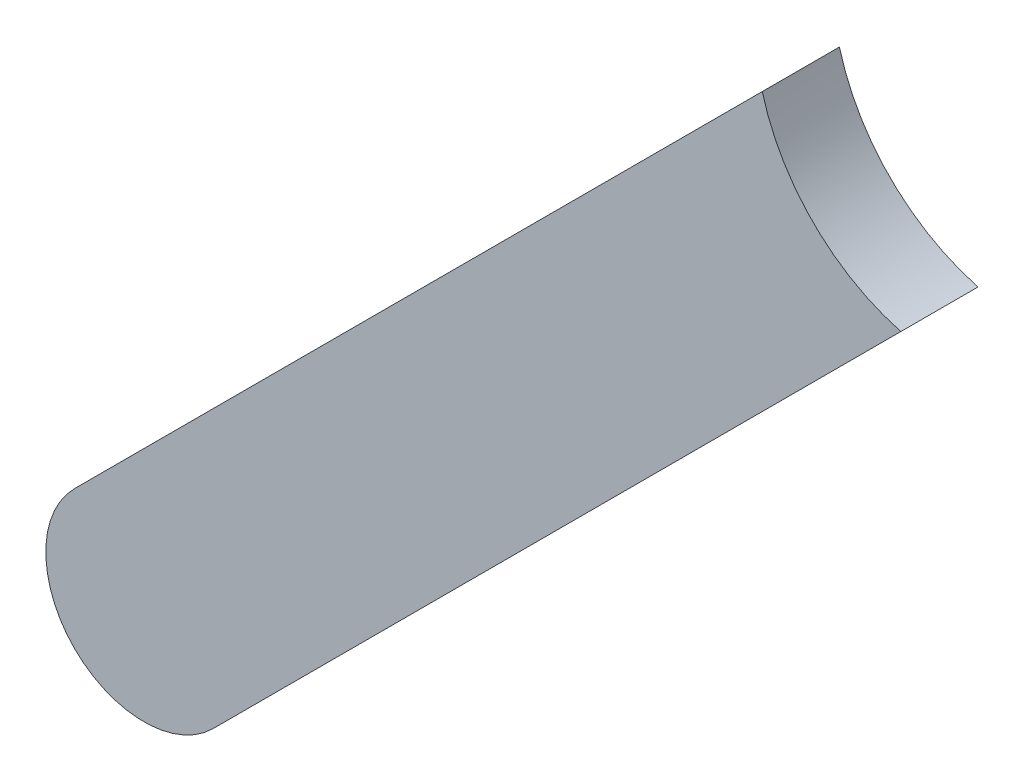
ISO-10303-21;
HEADER;
FILE_DESCRIPTION(('STEP AP214'),'2;1');
FILE_NAME('part.step','',(''),(''),'','','');
FILE_SCHEMA(('AUTOMOTIVE_DESIGN { 1 0 10303 214 1 1 1 1 }'));
ENDSEC;
DATA;
#1=APPLICATION_CONTEXT('core data for automotive mechanical design processes');
#2=APPLICATION_PROTOCOL_DEFINITION('international standard','automotive_design',2000,#1);
#3=PRODUCT_CONTEXT('',#1,'mechanical');
#4=PRODUCT('Part','Part','',(#3));
#5=PRODUCT_RELATED_PRODUCT_CATEGORY('part','',(#4));
#6=PRODUCT_DEFINITION_FORMATION('','',#4);
#7=PRODUCT_DEFINITION_CONTEXT('part definition',#1,'design');
#8=PRODUCT_DEFINITION('design','',#6,#7);
#9=PRODUCT_DEFINITION_SHAPE('','',#8);
#10=(LENGTH_UNIT() NAMED_UNIT(*) SI_UNIT(.MILLI.,.METRE.));
#11=(NAMED_UNIT(*) PLANE_ANGLE_UNIT() SI_UNIT($,.RADIAN.));
#12=(NAMED_UNIT(*) SI_UNIT($,.STERADIAN.) SOLID_ANGLE_UNIT());
#13=UNCERTAINTY_MEASURE_WITH_UNIT(LENGTH_MEASURE(1.E-05),#10,'distance_accuracy_value','');
#14=(GEOMETRIC_REPRESENTATION_CONTEXT(3) GLOBAL_UNCERTAINTY_ASSIGNED_CONTEXT((#13)) GLOBAL_UNIT_ASSIGNED_CONTEXT((#10,
#11,#12)) REPRESENTATION_CONTEXT('',''));
#15=CARTESIAN_POINT('',(0.,0.,0.));
#16=DIRECTION('',(0.,0.,1.));
#17=DIRECTION('',(1.,0.,0.));
#18=AXIS2_PLACEMENT_3D('',#15,#16,#17);
#19=CARTESIAN_POINT('',(150.8666782,52.88099406,0.));
#20=DIRECTION('',(-0.707106781186548,0.707106781186548,0.));
#21=DIRECTION('',(0.707106781186548,0.707106781186548,0.));
#22=AXIS2_PLACEMENT_3D('',#19,#20,#21);
#23=PLANE('',#22);
#24=DIRECTION('',(0.707106781186548,0.707106781186548,0.));
#25=VECTOR('',#24,1.);
#26=CARTESIAN_POINT('',(150.8666782,52.88099406,0.1999996));
#27=LINE('',#26,#25);
#28=CARTESIAN_POINT('',(150.8666782,52.88099406,0.1999996));
#29=VERTEX_POINT('',#28);
#30=CARTESIAN_POINT('',(152.649519211461,54.6638350714614,0.1999996));
#31=VERTEX_POINT('',#30);
#32=EDGE_CURVE('E11',#29,#31,#27,.T.);
#33=ORIENTED_EDGE('',*,*,#32,.F.);
#34=DIRECTION('',(0.,0.,1.));
#35=VECTOR('',#34,1.);
#36=CARTESIAN_POINT('',(150.8666782,52.88099406,0.));
#37=LINE('',#36,#35);
#38=CARTESIAN_POINT('',(150.8666782,52.88099406,0.));
#39=VERTEX_POINT('',#38);
#40=EDGE_CURVE('E24',#39,#29,#37,.T.);
#41=ORIENTED_EDGE('',*,*,#40,.F.);
#42=DIRECTION('',(0.707106781186548,0.707106781186548,0.));
#43=VECTOR('',#42,1.);
#44=CARTESIAN_POINT('',(150.8666782,52.88099406,0.));
#45=LINE('',#44,#43);
#46=CARTESIAN_POINT('',(152.649519211461,54.6638350714614,0.));
#47=VERTEX_POINT('',#46);
#48=EDGE_CURVE('E75',#39,#47,#45,.T.);
#49=ORIENTED_EDGE('',*,*,#48,.T.);
#50=DIRECTION('',(0.,0.,1.));
#51=VECTOR('',#50,1.);
#52=CARTESIAN_POINT('',(152.649519211461,54.6638350714614,0.));
#53=LINE('',#52,#51);
#54=EDGE_CURVE('E37',#47,#31,#53,.T.);
#55=ORIENTED_EDGE('',*,*,#54,.T.);
#56=EDGE_LOOP('',(#33,#41,#49,#55));
#57=FACE_BOUND('',#56,.T.);
#58=ADVANCED_FACE('F17',(#57),#23,.F.);
#59=CARTESIAN_POINT('',(152.781,55.1545252,0.));
#60=DIRECTION('',(0.,0.,-1.));
#61=DIRECTION('',(1.,0.,0.));
#62=AXIS2_PLACEMENT_3D('',#59,#60,#61);
#63=CYLINDRICAL_SURFACE('',#62,0.508);
#64=DIRECTION('',(0.,0.,1.));
#65=VECTOR('',#64,1.);
#66=CARTESIAN_POINT('',(152.290309871461,55.0230444114614,0.));
#67=LINE('',#66,#65);
#68=CARTESIAN_POINT('',(152.290309871461,55.0230444114614,0.));
#69=VERTEX_POINT('',#68);
#70=CARTESIAN_POINT('',(152.290309871461,55.0230444114614,0.1999996));
#71=VERTEX_POINT('',#70);
#72=EDGE_CURVE('E67',#69,#71,#67,.T.);
#73=ORIENTED_EDGE('',*,*,#72,.T.);
#74=CARTESIAN_POINT('',(152.781,55.1545252,0.1999996));
#75=DIRECTION('',(0.,0.,1.));
#76=DIRECTION('',(1.,0.,0.));
#77=AXIS2_PLACEMENT_3D('',#74,#75,#76);
#78=CIRCLE('',#77,0.508);
#79=EDGE_CURVE('E82',#71,#31,#78,.T.);
#80=ORIENTED_EDGE('',*,*,#79,.T.);
#81=ORIENTED_EDGE('',*,*,#54,.F.);
#82=CARTESIAN_POINT('',(152.781,55.1545252,0.));
#83=DIRECTION('',(0.,0.,1.));
#84=DIRECTION('',(1.,0.,0.));
#85=AXIS2_PLACEMENT_3D('',#82,#83,#84);
#86=CIRCLE('',#85,0.508);
#87=EDGE_CURVE('E80',#69,#47,#86,.T.);
#88=ORIENTED_EDGE('',*,*,#87,.F.);
#89=EDGE_LOOP('',(#73,#80,#81,#88));
#90=FACE_BOUND('',#89,.T.);
#91=ADVANCED_FACE('F88',(#90),#63,.F.);
#92=CARTESIAN_POINT('',(152.290309871461,55.0230444114614,0.));
#93=DIRECTION('',(0.707106781186544,-0.707106781186551,0.));
#94=DIRECTION('',(-0.707106781186551,-0.707106781186544,0.));
#95=AXIS2_PLACEMENT_3D('',#92,#93,#94);
#96=PLANE('',#95);
#97=DIRECTION('',(-0.707106781186551,-0.707106781186544,0.));
#98=VECTOR('',#97,1.);
#99=CARTESIAN_POINT('',(152.6013966,55.33413114,0.1999996));
#100=LINE('',#99,#98);
#101=CARTESIAN_POINT('',(150.50746886,53.2402034,0.1999996));
#102=VERTEX_POINT('',#101);
#103=EDGE_CURVE('E71',#71,#102,#100,.T.);
#104=ORIENTED_EDGE('',*,*,#103,.F.);
#105=ORIENTED_EDGE('',*,*,#72,.F.);
#106=DIRECTION('',(-0.707106781186551,-0.707106781186544,0.));
#107=VECTOR('',#106,1.);
#108=CARTESIAN_POINT('',(152.6013966,55.33413114,0.));
#109=LINE('',#108,#107);
#110=CARTESIAN_POINT('',(150.50746886,53.2402034,0.));
#111=VERTEX_POINT('',#110);
#112=EDGE_CURVE('E63',#69,#111,#109,.T.);
#113=ORIENTED_EDGE('',*,*,#112,.T.);
#114=DIRECTION('',(0.,0.,1.));
#115=VECTOR('',#114,1.);
#116=CARTESIAN_POINT('',(150.50746886,53.2402034,0.));
#117=LINE('',#116,#115);
#118=EDGE_CURVE('E53',#111,#102,#117,.T.);
#119=ORIENTED_EDGE('',*,*,#118,.T.);
#120=EDGE_LOOP('',(#104,#105,#113,#119));
#121=FACE_BOUND('',#120,.T.);
#122=ADVANCED_FACE('F66',(#121),#96,.F.);
#123=CARTESIAN_POINT('',(150.68707353,53.06059873,0.));
#124=DIRECTION('',(0.,0.,-1.));
#125=DIRECTION('',(-0.707106781186548,0.707106781186548,0.));
#126=AXIS2_PLACEMENT_3D('',#123,#124,#125);
#127=CYLINDRICAL_SURFACE('',#126,0.253999360179546);
#128=CARTESIAN_POINT('',(150.68707353,53.06059873,0.1999996));
#129=DIRECTION('',(0.,0.,1.));
#130=DIRECTION('',(-0.707106781186548,0.707106781186548,0.));
#131=AXIS2_PLACEMENT_3D('',#128,#129,#130);
#132=CIRCLE('',#131,0.253999360179546);
#133=EDGE_CURVE('E59',#102,#29,#132,.T.);
#134=ORIENTED_EDGE('',*,*,#133,.F.);
#135=ORIENTED_EDGE('',*,*,#118,.F.);
#136=CARTESIAN_POINT('',(150.68707353,53.06059873,0.));
#137=DIRECTION('',(0.,0.,1.));
#138=DIRECTION('',(-0.707106781186548,0.707106781186548,0.));
#139=AXIS2_PLACEMENT_3D('',#136,#137,#138);
#140=CIRCLE('',#139,0.253999360179546);
#141=EDGE_CURVE('E57',#111,#39,#140,.T.);
#142=ORIENTED_EDGE('',*,*,#141,.T.);
#143=ORIENTED_EDGE('',*,*,#40,.T.);
#144=EDGE_LOOP('',(#134,#135,#142,#143));
#145=FACE_BOUND('',#144,.T.);
#146=ADVANCED_FACE('F55',(#145),#127,.T.);
#147=CARTESIAN_POINT('',(150.8666782,52.88099406,0.));
#148=DIRECTION('',(0.,0.,-1.));
#149=DIRECTION('',(-1.,0.,0.));
#150=AXIS2_PLACEMENT_3D('',#147,#148,#149);
#151=PLANE('',#150);
#152=ORIENTED_EDGE('',*,*,#48,.F.);
#153=ORIENTED_EDGE('',*,*,#141,.F.);
#154=ORIENTED_EDGE('',*,*,#112,.F.);
#155=ORIENTED_EDGE('',*,*,#87,.T.);
#156=EDGE_LOOP('',(#152,#153,#154,#155));
#157=FACE_BOUND('',#156,.T.);
#158=ADVANCED_FACE('F74',(#157),#151,.T.);
#159=CARTESIAN_POINT('',(150.8666782,52.88099406,0.1999996));
#160=DIRECTION('',(0.,0.,-1.));
#161=DIRECTION('',(-1.,0.,0.));
#162=AXIS2_PLACEMENT_3D('',#159,#160,#161);
#163=PLANE('',#162);
#164=ORIENTED_EDGE('',*,*,#133,.T.);
#165=ORIENTED_EDGE('',*,*,#32,.T.);
#166=ORIENTED_EDGE('',*,*,#79,.F.);
#167=ORIENTED_EDGE('',*,*,#103,.T.);
#168=EDGE_LOOP('',(#164,#165,#166,#167));
#169=FACE_BOUND('',#168,.T.);
#170=ADVANCED_FACE('F91',(#169),#163,.F.);
#171=CLOSED_SHELL('',(#58,#91,#122,#146,#158,#170));
#172=MANIFOLD_SOLID_BREP('B1',#171);
#173=ADVANCED_BREP_SHAPE_REPRESENTATION('',(#18,#172),#14);
#174=SHAPE_DEFINITION_REPRESENTATION(#9,#173);
ENDSEC;
END-ISO-10303-21;
